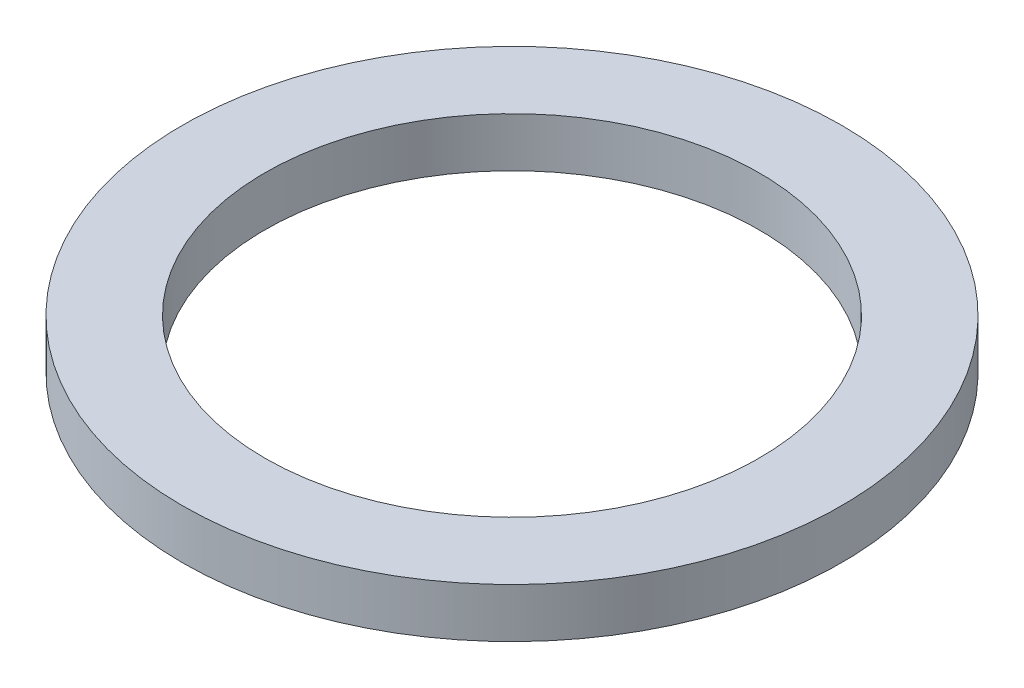
ISO-10303-21;
HEADER;
FILE_DESCRIPTION(('STEP AP214'),'2;1');
FILE_NAME('part.step','',(''),(''),'','','');
FILE_SCHEMA(('AUTOMOTIVE_DESIGN { 1 0 10303 214 1 1 1 1 }'));
ENDSEC;
DATA;
#1=APPLICATION_CONTEXT('core data for automotive mechanical design processes');
#2=APPLICATION_PROTOCOL_DEFINITION('international standard','automotive_design',2000,#1);
#3=PRODUCT_CONTEXT('',#1,'mechanical');
#4=PRODUCT('Part','Part','',(#3));
#5=PRODUCT_RELATED_PRODUCT_CATEGORY('part','',(#4));
#6=PRODUCT_DEFINITION_FORMATION('','',#4);
#7=PRODUCT_DEFINITION_CONTEXT('part definition',#1,'design');
#8=PRODUCT_DEFINITION('design','',#6,#7);
#9=PRODUCT_DEFINITION_SHAPE('','',#8);
#10=(LENGTH_UNIT() NAMED_UNIT(*) SI_UNIT(.MILLI.,.METRE.));
#11=(NAMED_UNIT(*) PLANE_ANGLE_UNIT() SI_UNIT($,.RADIAN.));
#12=(NAMED_UNIT(*) SI_UNIT($,.STERADIAN.) SOLID_ANGLE_UNIT());
#13=UNCERTAINTY_MEASURE_WITH_UNIT(LENGTH_MEASURE(1.E-05),#10,'distance_accuracy_value','');
#14=(GEOMETRIC_REPRESENTATION_CONTEXT(3) GLOBAL_UNCERTAINTY_ASSIGNED_CONTEXT((#13)) GLOBAL_UNIT_ASSIGNED_CONTEXT((#10,
#11,#12)) REPRESENTATION_CONTEXT('',''));
#15=CARTESIAN_POINT('',(0.,0.,0.));
#16=DIRECTION('',(0.,0.,1.));
#17=DIRECTION('',(1.,0.,0.));
#18=AXIS2_PLACEMENT_3D('',#15,#16,#17);
#19=CARTESIAN_POINT('',(0.,1.5,0.));
#20=DIRECTION('',(0.,1.,0.));
#21=DIRECTION('',(0.,0.,1.));
#22=AXIS2_PLACEMENT_3D('',#19,#20,#21);
#23=PLANE('',#22);
#24=CARTESIAN_POINT('',(0.,1.5,0.));
#25=DIRECTION('',(0.,1.,0.));
#26=DIRECTION('',(0.,0.,1.));
#27=AXIS2_PLACEMENT_3D('',#24,#25,#26);
#28=CIRCLE('',#27,10.);
#29=CARTESIAN_POINT('',(0.,1.5,10.));
#30=VERTEX_POINT('',#29);
#31=EDGE_CURVE('E10',#30,#30,#28,.T.);
#32=ORIENTED_EDGE('',*,*,#31,.T.);
#33=EDGE_LOOP('',(#32));
#34=FACE_BOUND('',#33,.T.);
#35=CARTESIAN_POINT('',(0.,1.5,0.));
#36=DIRECTION('',(0.,1.,0.));
#37=DIRECTION('',(0.,0.,1.));
#38=AXIS2_PLACEMENT_3D('',#35,#36,#37);
#39=CIRCLE('',#38,7.5);
#40=CARTESIAN_POINT('',(0.,1.5,7.5));
#41=VERTEX_POINT('',#40);
#42=EDGE_CURVE('E54',#41,#41,#39,.T.);
#43=ORIENTED_EDGE('',*,*,#42,.F.);
#44=EDGE_LOOP('',(#43));
#45=FACE_BOUND('',#44,.T.);
#46=ADVANCED_FACE('F41',(#34,#45),#23,.T.);
#47=CARTESIAN_POINT('',(0.,0.,0.));
#48=DIRECTION('',(0.,1.,0.));
#49=DIRECTION('',(0.,0.,1.));
#50=AXIS2_PLACEMENT_3D('',#47,#48,#49);
#51=PLANE('',#50);
#52=CARTESIAN_POINT('',(0.,0.,0.));
#53=DIRECTION('',(0.,1.,0.));
#54=DIRECTION('',(0.,0.,1.));
#55=AXIS2_PLACEMENT_3D('',#52,#53,#54);
#56=CIRCLE('',#55,10.);
#57=CARTESIAN_POINT('',(0.,0.,10.));
#58=VERTEX_POINT('',#57);
#59=EDGE_CURVE('E45',#58,#58,#56,.T.);
#60=ORIENTED_EDGE('',*,*,#59,.F.);
#61=EDGE_LOOP('',(#60));
#62=FACE_BOUND('',#61,.T.);
#63=CARTESIAN_POINT('',(0.,0.,0.));
#64=DIRECTION('',(0.,1.,0.));
#65=DIRECTION('',(0.,0.,1.));
#66=AXIS2_PLACEMENT_3D('',#63,#64,#65);
#67=CIRCLE('',#66,7.5);
#68=CARTESIAN_POINT('',(0.,0.,7.5));
#69=VERTEX_POINT('',#68);
#70=EDGE_CURVE('E56',#69,#69,#67,.T.);
#71=ORIENTED_EDGE('',*,*,#70,.T.);
#72=EDGE_LOOP('',(#71));
#73=FACE_BOUND('',#72,.T.);
#74=ADVANCED_FACE('F68',(#62,#73),#51,.F.);
#75=CARTESIAN_POINT('',(0.,1.5,0.));
#76=DIRECTION('',(0.,-1.,0.));
#77=DIRECTION('',(0.,0.,-1.));
#78=AXIS2_PLACEMENT_3D('',#75,#76,#77);
#79=CYLINDRICAL_SURFACE('',#78,10.);
#80=ORIENTED_EDGE('',*,*,#31,.F.);
#81=EDGE_LOOP('',(#80));
#82=FACE_BOUND('',#81,.T.);
#83=ORIENTED_EDGE('',*,*,#59,.T.);
#84=EDGE_LOOP('',(#83));
#85=FACE_BOUND('',#84,.T.);
#86=ADVANCED_FACE('F43',(#82,#85),#79,.T.);
#87=CARTESIAN_POINT('',(0.,1.5,0.));
#88=DIRECTION('',(0.,-1.,0.));
#89=DIRECTION('',(0.,0.,-1.));
#90=AXIS2_PLACEMENT_3D('',#87,#88,#89);
#91=CYLINDRICAL_SURFACE('',#90,7.5);
#92=ORIENTED_EDGE('',*,*,#42,.T.);
#93=EDGE_LOOP('',(#92));
#94=FACE_BOUND('',#93,.T.);
#95=ORIENTED_EDGE('',*,*,#70,.F.);
#96=EDGE_LOOP('',(#95));
#97=FACE_BOUND('',#96,.T.);
#98=ADVANCED_FACE('F64',(#94,#97),#91,.F.);
#99=CLOSED_SHELL('',(#46,#74,#86,#98));
#100=MANIFOLD_SOLID_BREP('B2',#99);
#101=ADVANCED_BREP_SHAPE_REPRESENTATION('',(#18,#100),#14);
#102=SHAPE_DEFINITION_REPRESENTATION(#9,#101);
ENDSEC;
END-ISO-10303-21;
